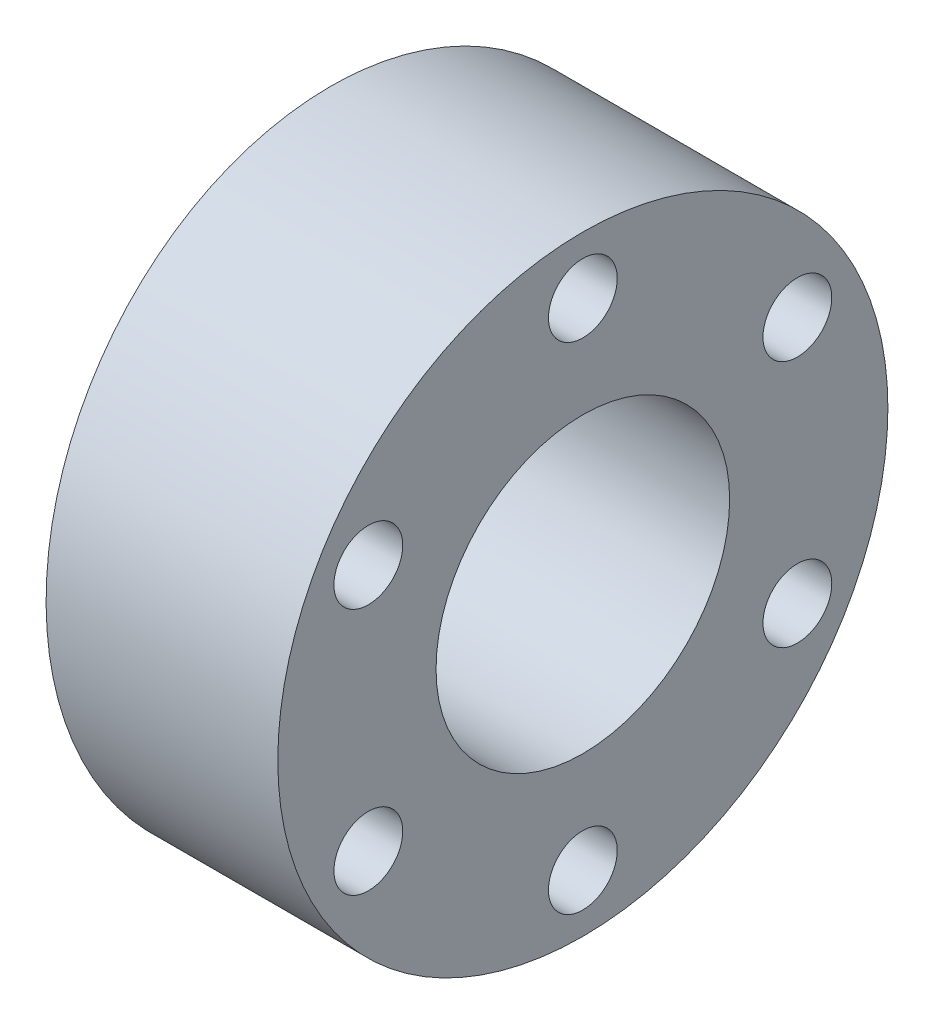
ISO-10303-21;
HEADER;
FILE_DESCRIPTION(('STEP AP214'),'2;1');
FILE_NAME('part.step','',(''),(''),'','','');
FILE_SCHEMA(('AUTOMOTIVE_DESIGN { 1 0 10303 214 1 1 1 1 }'));
ENDSEC;
DATA;
#1=APPLICATION_CONTEXT('core data for automotive mechanical design processes');
#2=APPLICATION_PROTOCOL_DEFINITION('international standard','automotive_design',2000,#1);
#3=PRODUCT_CONTEXT('',#1,'mechanical');
#4=PRODUCT('Part','Part','',(#3));
#5=PRODUCT_RELATED_PRODUCT_CATEGORY('part','',(#4));
#6=PRODUCT_DEFINITION_FORMATION('','',#4);
#7=PRODUCT_DEFINITION_CONTEXT('part definition',#1,'design');
#8=PRODUCT_DEFINITION('design','',#6,#7);
#9=PRODUCT_DEFINITION_SHAPE('','',#8);
#10=(LENGTH_UNIT() NAMED_UNIT(*) SI_UNIT(.MILLI.,.METRE.));
#11=(NAMED_UNIT(*) PLANE_ANGLE_UNIT() SI_UNIT($,.RADIAN.));
#12=(NAMED_UNIT(*) SI_UNIT($,.STERADIAN.) SOLID_ANGLE_UNIT());
#13=UNCERTAINTY_MEASURE_WITH_UNIT(LENGTH_MEASURE(1.E-05),#10,'distance_accuracy_value','');
#14=(GEOMETRIC_REPRESENTATION_CONTEXT(3) GLOBAL_UNCERTAINTY_ASSIGNED_CONTEXT((#13)) GLOBAL_UNIT_ASSIGNED_CONTEXT((#10,
#11,#12)) REPRESENTATION_CONTEXT('',''));
#15=CARTESIAN_POINT('',(0.,0.,0.));
#16=DIRECTION('',(0.,0.,1.));
#17=DIRECTION('',(1.,0.,0.));
#18=AXIS2_PLACEMENT_3D('',#15,#16,#17);
#19=CARTESIAN_POINT('',(13.97,0.,0.));
#20=DIRECTION('',(-1.,0.,0.));
#21=DIRECTION('',(0.,0.,1.));
#22=AXIS2_PLACEMENT_3D('',#19,#20,#21);
#23=CYLINDRICAL_SURFACE('',#22,16.891);
#24=CARTESIAN_POINT('',(13.97,0.,0.));
#25=DIRECTION('',(1.,0.,0.));
#26=DIRECTION('',(0.,0.,-1.));
#27=AXIS2_PLACEMENT_3D('',#24,#25,#26);
#28=CIRCLE('',#27,16.891);
#29=CARTESIAN_POINT('',(13.97,0.,-16.891));
#30=VERTEX_POINT('',#29);
#31=EDGE_CURVE('E10',#30,#30,#28,.T.);
#32=ORIENTED_EDGE('',*,*,#31,.F.);
#33=EDGE_LOOP('',(#32));
#34=FACE_BOUND('',#33,.T.);
#35=CARTESIAN_POINT('',(1.18113378053772,0.,0.));
#36=DIRECTION('',(0.997564050259825,0.0697564737441184,0.));
#37=DIRECTION('',(-0.0697564737441184,0.997564050259825,0.));
#38=AXIS2_PLACEMENT_3D('',#35,#36,#37);
#39=ELLIPSE('',#38,16.9322461004891,16.891);
#40=CARTESIAN_POINT('',(0.,16.891,0.));
#41=VERTEX_POINT('',#40);
#42=EDGE_CURVE('E57',#41,#41,#39,.T.);
#43=ORIENTED_EDGE('',*,*,#42,.T.);
#44=EDGE_LOOP('',(#43));
#45=FACE_BOUND('',#44,.T.);
#46=ADVANCED_FACE('F45',(#34,#45),#23,.T.);
#47=CARTESIAN_POINT('',(13.97,0.,0.));
#48=DIRECTION('',(1.,0.,0.));
#49=DIRECTION('',(0.,0.,-1.));
#50=AXIS2_PLACEMENT_3D('',#47,#48,#49);
#51=PLANE('',#50);
#52=CARTESIAN_POINT('',(13.97,6.85800000000014,-11.8784044383073));
#53=DIRECTION('',(1.,0.,0.));
#54=DIRECTION('',(0.,-0.866025403784433,-0.50000000000001));
#55=AXIS2_PLACEMENT_3D('',#52,#53,#54);
#56=CIRCLE('',#55,1.905);
#57=CARTESIAN_POINT('',(13.97,5.20822160579079,-12.8309044383073));
#58=VERTEX_POINT('',#57);
#59=EDGE_CURVE('E120',#58,#58,#56,.T.);
#60=ORIENTED_EDGE('',*,*,#59,.F.);
#61=EDGE_LOOP('',(#60));
#62=FACE_BOUND('',#61,.T.);
#63=CARTESIAN_POINT('',(13.97,-6.85799999999989,-11.8784044383074));
#64=DIRECTION('',(1.,0.,0.));
#65=DIRECTION('',(0.,-0.866025403784443,0.499999999999992));
#66=AXIS2_PLACEMENT_3D('',#63,#64,#65);
#67=CIRCLE('',#66,1.905);
#68=CARTESIAN_POINT('',(13.97,-8.50777839420925,-10.9259044383074));
#69=VERTEX_POINT('',#68);
#70=EDGE_CURVE('E124',#69,#69,#67,.T.);
#71=ORIENTED_EDGE('',*,*,#70,.F.);
#72=EDGE_LOOP('',(#71));
#73=FACE_BOUND('',#72,.T.);
#74=CARTESIAN_POINT('',(13.97,-13.716,0.));
#75=DIRECTION('',(1.,0.,0.));
#76=DIRECTION('',(0.,0.,1.));
#77=AXIS2_PLACEMENT_3D('',#74,#75,#76);
#78=CIRCLE('',#77,1.905);
#79=CARTESIAN_POINT('',(13.97,-13.716,1.905));
#80=VERTEX_POINT('',#79);
#81=EDGE_CURVE('E128',#80,#80,#78,.T.);
#82=ORIENTED_EDGE('',*,*,#81,.F.);
#83=EDGE_LOOP('',(#82));
#84=FACE_BOUND('',#83,.T.);
#85=CARTESIAN_POINT('',(13.97,-6.85800000000006,11.8784044383073));
#86=DIRECTION('',(1.,0.,0.));
#87=DIRECTION('',(0.,0.866025403784436,0.500000000000004));
#88=AXIS2_PLACEMENT_3D('',#85,#86,#87);
#89=CIRCLE('',#88,1.905);
#90=CARTESIAN_POINT('',(13.97,-5.2082216057907,12.8309044383073));
#91=VERTEX_POINT('',#90);
#92=EDGE_CURVE('E132',#91,#91,#89,.T.);
#93=ORIENTED_EDGE('',*,*,#92,.F.);
#94=EDGE_LOOP('',(#93));
#95=FACE_BOUND('',#94,.T.);
#96=CARTESIAN_POINT('',(13.97,6.85799999999997,11.8784044383074));
#97=DIRECTION('',(1.,0.,0.));
#98=DIRECTION('',(0.,0.86602540378444,-0.499999999999998));
#99=AXIS2_PLACEMENT_3D('',#96,#97,#98);
#100=CIRCLE('',#99,1.905);
#101=CARTESIAN_POINT('',(13.97,8.50777839420933,10.9259044383074));
#102=VERTEX_POINT('',#101);
#103=EDGE_CURVE('E72',#102,#102,#100,.T.);
#104=ORIENTED_EDGE('',*,*,#103,.F.);
#105=EDGE_LOOP('',(#104));
#106=FACE_BOUND('',#105,.T.);
#107=CARTESIAN_POINT('',(13.97,13.716,0.));
#108=DIRECTION('',(1.,0.,0.));
#109=DIRECTION('',(0.,0.,-1.));
#110=AXIS2_PLACEMENT_3D('',#107,#108,#109);
#111=CIRCLE('',#110,1.905);
#112=CARTESIAN_POINT('',(13.97,13.716,-1.905));
#113=VERTEX_POINT('',#112);
#114=EDGE_CURVE('E67',#113,#113,#111,.T.);
#115=ORIENTED_EDGE('',*,*,#114,.F.);
#116=EDGE_LOOP('',(#115));
#117=FACE_BOUND('',#116,.T.);
#118=CARTESIAN_POINT('',(13.97,0.,0.));
#119=DIRECTION('',(1.,0.,0.));
#120=DIRECTION('',(0.,0.,-1.));
#121=AXIS2_PLACEMENT_3D('',#118,#119,#120);
#122=CIRCLE('',#121,8.128);
#123=CARTESIAN_POINT('',(13.97,0.,-8.128));
#124=VERTEX_POINT('',#123);
#125=EDGE_CURVE('E52',#124,#124,#122,.T.);
#126=ORIENTED_EDGE('',*,*,#125,.F.);
#127=EDGE_LOOP('',(#126));
#128=FACE_BOUND('',#127,.T.);
#129=ORIENTED_EDGE('',*,*,#31,.T.);
#130=EDGE_LOOP('',(#129));
#131=FACE_BOUND('',#130,.T.);
#132=ADVANCED_FACE('F107',(#62,#73,#84,#95,#106,#117,#128,#131),#51,.T.);
#133=CARTESIAN_POINT('',(0.,0.,0.));
#134=DIRECTION('',(1.,0.,0.));
#135=DIRECTION('',(0.,0.,-1.));
#136=AXIS2_PLACEMENT_3D('',#133,#134,#135);
#137=CYLINDRICAL_SURFACE('',#136,8.128);
#138=CARTESIAN_POINT('',(1.18113378053772,0.,0.));
#139=DIRECTION('',(0.997564050259825,0.0697564737441184,0.));
#140=DIRECTION('',(0.0697564737441184,-0.997564050259825,0.));
#141=AXIS2_PLACEMENT_3D('',#138,#139,#140);
#142=ELLIPSE('',#141,8.14784774760376,8.128);
#143=CARTESIAN_POINT('',(1.74949890801451,-8.128,0.));
#144=VERTEX_POINT('',#143);
#145=EDGE_CURVE('E61',#144,#144,#142,.F.);
#146=ORIENTED_EDGE('',*,*,#145,.T.);
#147=EDGE_LOOP('',(#146));
#148=FACE_BOUND('',#147,.T.);
#149=ORIENTED_EDGE('',*,*,#125,.T.);
#150=EDGE_LOOP('',(#149));
#151=FACE_BOUND('',#150,.T.);
#152=ADVANCED_FACE('F97',(#148,#151),#137,.F.);
#153=CARTESIAN_POINT('',(0.,16.891,-16.891));
#154=DIRECTION('',(0.997564050259825,0.0697564737441184,0.));
#155=DIRECTION('',(-0.0697564737441184,0.997564050259825,0.));
#156=AXIS2_PLACEMENT_3D('',#153,#154,#155);
#157=PLANE('',#156);
#158=CARTESIAN_POINT('',(0.701575704229161,6.85800000000014,-11.8784044383073));
#159=DIRECTION('',(0.997564050259825,0.0697564737441184,0.));
#160=DIRECTION('',(0.0697564737441184,-0.997564050259825,0.));
#161=AXIS2_PLACEMENT_3D('',#158,#159,#160);
#162=ELLIPSE('',#161,1.90965181584463,1.905);
#163=CARTESIAN_POINT('',(0.834786280981535,4.95300000000014,-11.8784044383073));
#164=VERTEX_POINT('',#163);
#165=EDGE_CURVE('E48',#164,#164,#162,.T.);
#166=ORIENTED_EDGE('',*,*,#165,.T.);
#167=EDGE_LOOP('',(#166));
#168=FACE_BOUND('',#167,.T.);
#169=CARTESIAN_POINT('',(1.66069185684626,-6.85799999999989,-11.8784044383074));
#170=DIRECTION('',(0.997564050259825,0.0697564737441184,0.));
#171=DIRECTION('',(0.0697564737441184,-0.997564050259825,0.));
#172=AXIS2_PLACEMENT_3D('',#169,#170,#171);
#173=ELLIPSE('',#172,1.90965181584463,1.905);
#174=CARTESIAN_POINT('',(1.79390243359863,-8.76299999999989,-11.8784044383074));
#175=VERTEX_POINT('',#174);
#176=EDGE_CURVE('E77',#175,#175,#173,.T.);
#177=ORIENTED_EDGE('',*,*,#176,.T.);
#178=EDGE_LOOP('',(#177));
#179=FACE_BOUND('',#178,.T.);
#180=CARTESIAN_POINT('',(2.14024993315481,-13.716,0.));
#181=DIRECTION('',(0.997564050259825,0.0697564737441184,0.));
#182=DIRECTION('',(0.0697564737441184,-0.997564050259825,0.));
#183=AXIS2_PLACEMENT_3D('',#180,#181,#182);
#184=ELLIPSE('',#183,1.90965181584463,1.905);
#185=CARTESIAN_POINT('',(2.27346050990719,-15.621,0.));
#186=VERTEX_POINT('',#185);
#187=EDGE_CURVE('E75',#186,#186,#184,.T.);
#188=ORIENTED_EDGE('',*,*,#187,.T.);
#189=EDGE_LOOP('',(#188));
#190=FACE_BOUND('',#189,.T.);
#191=CARTESIAN_POINT('',(1.66069185684627,-6.85800000000006,11.8784044383073));
#192=DIRECTION('',(0.997564050259825,0.0697564737441184,0.));
#193=DIRECTION('',(0.0697564737441184,-0.997564050259825,0.));
#194=AXIS2_PLACEMENT_3D('',#191,#192,#193);
#195=ELLIPSE('',#194,1.90965181584463,1.905);
#196=CARTESIAN_POINT('',(1.79390243359864,-8.76300000000006,11.8784044383073));
#197=VERTEX_POINT('',#196);
#198=EDGE_CURVE('E71',#197,#197,#195,.T.);
#199=ORIENTED_EDGE('',*,*,#198,.T.);
#200=EDGE_LOOP('',(#199));
#201=FACE_BOUND('',#200,.T.);
#202=CARTESIAN_POINT('',(0.701575704229172,6.85799999999997,11.8784044383074));
#203=DIRECTION('',(0.997564050259825,0.0697564737441184,0.));
#204=DIRECTION('',(0.0697564737441184,-0.997564050259825,0.));
#205=AXIS2_PLACEMENT_3D('',#202,#203,#204);
#206=ELLIPSE('',#205,1.90965181584463,1.905);
#207=CARTESIAN_POINT('',(0.834786280981547,4.95299999999997,11.8784044383074));
#208=VERTEX_POINT('',#207);
#209=EDGE_CURVE('E68',#208,#208,#206,.T.);
#210=ORIENTED_EDGE('',*,*,#209,.T.);
#211=EDGE_LOOP('',(#210));
#212=FACE_BOUND('',#211,.T.);
#213=CARTESIAN_POINT('',(0.222017627920623,13.716,0.));
#214=DIRECTION('',(0.997564050259825,0.0697564737441184,0.));
#215=DIRECTION('',(0.0697564737441184,-0.997564050259825,0.));
#216=AXIS2_PLACEMENT_3D('',#213,#214,#215);
#217=ELLIPSE('',#216,1.90965181584463,1.905);
#218=CARTESIAN_POINT('',(0.355228204672998,11.811,0.));
#219=VERTEX_POINT('',#218);
#220=EDGE_CURVE('E64',#219,#219,#217,.T.);
#221=ORIENTED_EDGE('',*,*,#220,.T.);
#222=EDGE_LOOP('',(#221));
#223=FACE_BOUND('',#222,.T.);
#224=ORIENTED_EDGE('',*,*,#145,.F.);
#225=EDGE_LOOP('',(#224));
#226=FACE_BOUND('',#225,.T.);
#227=ORIENTED_EDGE('',*,*,#42,.F.);
#228=EDGE_LOOP('',(#227));
#229=FACE_BOUND('',#228,.T.);
#230=ADVANCED_FACE('F94',(#168,#179,#190,#201,#212,#223,#226,#229),#157,.F.);
#231=CARTESIAN_POINT('',(0.,13.716,0.));
#232=DIRECTION('',(1.,0.,0.));
#233=DIRECTION('',(0.,0.,-1.));
#234=AXIS2_PLACEMENT_3D('',#231,#232,#233);
#235=CYLINDRICAL_SURFACE('',#234,1.905);
#236=ORIENTED_EDGE('',*,*,#114,.T.);
#237=EDGE_LOOP('',(#236));
#238=FACE_BOUND('',#237,.T.);
#239=ORIENTED_EDGE('',*,*,#220,.F.);
#240=EDGE_LOOP('',(#239));
#241=FACE_BOUND('',#240,.T.);
#242=ADVANCED_FACE('F96',(#238,#241),#235,.F.);
#243=CARTESIAN_POINT('',(0.,6.85799999999997,11.8784044383074));
#244=DIRECTION('',(1.,0.,0.));
#245=DIRECTION('',(0.,0.,-1.));
#246=AXIS2_PLACEMENT_3D('',#243,#244,#245);
#247=CYLINDRICAL_SURFACE('',#246,1.905);
#248=ORIENTED_EDGE('',*,*,#103,.T.);
#249=EDGE_LOOP('',(#248));
#250=FACE_BOUND('',#249,.T.);
#251=ORIENTED_EDGE('',*,*,#209,.F.);
#252=EDGE_LOOP('',(#251));
#253=FACE_BOUND('',#252,.T.);
#254=ADVANCED_FACE('F104',(#250,#253),#247,.F.);
#255=CARTESIAN_POINT('',(0.,-6.85800000000006,11.8784044383073));
#256=DIRECTION('',(1.,0.,0.));
#257=DIRECTION('',(0.,0.,-1.));
#258=AXIS2_PLACEMENT_3D('',#255,#256,#257);
#259=CYLINDRICAL_SURFACE('',#258,1.905);
#260=ORIENTED_EDGE('',*,*,#92,.T.);
#261=EDGE_LOOP('',(#260));
#262=FACE_BOUND('',#261,.T.);
#263=ORIENTED_EDGE('',*,*,#198,.F.);
#264=EDGE_LOOP('',(#263));
#265=FACE_BOUND('',#264,.T.);
#266=ADVANCED_FACE('F158',(#262,#265),#259,.F.);
#267=CARTESIAN_POINT('',(0.,-13.716,0.));
#268=DIRECTION('',(1.,0.,0.));
#269=DIRECTION('',(0.,0.,-1.));
#270=AXIS2_PLACEMENT_3D('',#267,#268,#269);
#271=CYLINDRICAL_SURFACE('',#270,1.905);
#272=ORIENTED_EDGE('',*,*,#81,.T.);
#273=EDGE_LOOP('',(#272));
#274=FACE_BOUND('',#273,.T.);
#275=ORIENTED_EDGE('',*,*,#187,.F.);
#276=EDGE_LOOP('',(#275));
#277=FACE_BOUND('',#276,.T.);
#278=ADVANCED_FACE('F153',(#274,#277),#271,.F.);
#279=CARTESIAN_POINT('',(0.,-6.85799999999989,-11.8784044383074));
#280=DIRECTION('',(1.,0.,0.));
#281=DIRECTION('',(0.,0.,-1.));
#282=AXIS2_PLACEMENT_3D('',#279,#280,#281);
#283=CYLINDRICAL_SURFACE('',#282,1.905);
#284=ORIENTED_EDGE('',*,*,#70,.T.);
#285=EDGE_LOOP('',(#284));
#286=FACE_BOUND('',#285,.T.);
#287=ORIENTED_EDGE('',*,*,#176,.F.);
#288=EDGE_LOOP('',(#287));
#289=FACE_BOUND('',#288,.T.);
#290=ADVANCED_FACE('F148',(#286,#289),#283,.F.);
#291=CARTESIAN_POINT('',(0.,6.85800000000014,-11.8784044383073));
#292=DIRECTION('',(1.,0.,0.));
#293=DIRECTION('',(0.,0.,-1.));
#294=AXIS2_PLACEMENT_3D('',#291,#292,#293);
#295=CYLINDRICAL_SURFACE('',#294,1.905);
#296=ORIENTED_EDGE('',*,*,#59,.T.);
#297=EDGE_LOOP('',(#296));
#298=FACE_BOUND('',#297,.T.);
#299=ORIENTED_EDGE('',*,*,#165,.F.);
#300=EDGE_LOOP('',(#299));
#301=FACE_BOUND('',#300,.T.);
#302=ADVANCED_FACE('F145',(#298,#301),#295,.F.);
#303=CLOSED_SHELL('',(#46,#132,#152,#230,#242,#254,#266,#278,#290,#302));
#304=MANIFOLD_SOLID_BREP('B2',#303);
#305=ADVANCED_BREP_SHAPE_REPRESENTATION('',(#18,#304),#14);
#306=SHAPE_DEFINITION_REPRESENTATION(#9,#305);
ENDSEC;
END-ISO-10303-21;
